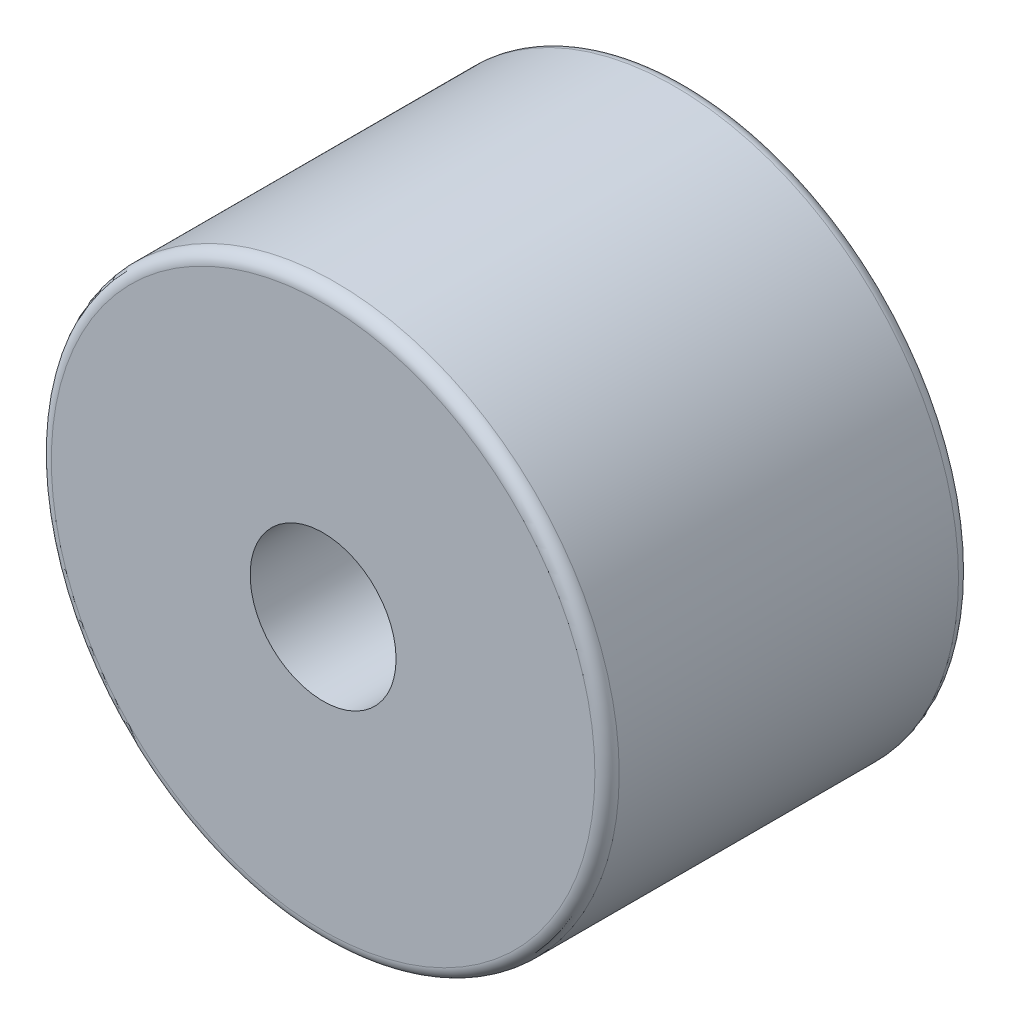
ISO-10303-21;
HEADER;
FILE_DESCRIPTION(('STEP AP214'),'2;1');
FILE_NAME('part.step','',(''),(''),'','','');
FILE_SCHEMA(('AUTOMOTIVE_DESIGN { 1 0 10303 214 1 1 1 1 }'));
ENDSEC;
DATA;
#1=APPLICATION_CONTEXT('core data for automotive mechanical design processes');
#2=APPLICATION_PROTOCOL_DEFINITION('international standard','automotive_design',2000,#1);
#3=PRODUCT_CONTEXT('',#1,'mechanical');
#4=PRODUCT('Part','Part','',(#3));
#5=PRODUCT_RELATED_PRODUCT_CATEGORY('part','',(#4));
#6=PRODUCT_DEFINITION_FORMATION('','',#4);
#7=PRODUCT_DEFINITION_CONTEXT('part definition',#1,'design');
#8=PRODUCT_DEFINITION('design','',#6,#7);
#9=PRODUCT_DEFINITION_SHAPE('','',#8);
#10=(LENGTH_UNIT() NAMED_UNIT(*) SI_UNIT(.MILLI.,.METRE.));
#11=(NAMED_UNIT(*) PLANE_ANGLE_UNIT() SI_UNIT($,.RADIAN.));
#12=(NAMED_UNIT(*) SI_UNIT($,.STERADIAN.) SOLID_ANGLE_UNIT());
#13=UNCERTAINTY_MEASURE_WITH_UNIT(LENGTH_MEASURE(1.E-05),#10,'distance_accuracy_value','');
#14=(GEOMETRIC_REPRESENTATION_CONTEXT(3) GLOBAL_UNCERTAINTY_ASSIGNED_CONTEXT((#13)) GLOBAL_UNIT_ASSIGNED_CONTEXT((#10,
#11,#12)) REPRESENTATION_CONTEXT('',''));
#15=CARTESIAN_POINT('',(0.,0.,0.));
#16=DIRECTION('',(0.,0.,1.));
#17=DIRECTION('',(1.,0.,0.));
#18=AXIS2_PLACEMENT_3D('',#15,#16,#17);
#19=CARTESIAN_POINT('',(0.,0.,0.));
#20=DIRECTION('',(0.,0.,1.));
#21=DIRECTION('',(1.,0.,0.));
#22=AXIS2_PLACEMENT_3D('',#19,#20,#21);
#23=PLANE('',#22);
#24=CARTESIAN_POINT('',(0.,0.,0.));
#25=DIRECTION('',(0.,0.,1.));
#26=DIRECTION('',(1.,0.,0.));
#27=AXIS2_PLACEMENT_3D('',#24,#25,#26);
#28=CIRCLE('',#27,0.6);
#29=CARTESIAN_POINT('',(0.6,0.,0.));
#30=VERTEX_POINT('',#29);
#31=EDGE_CURVE('E10',#30,#30,#28,.T.);
#32=ORIENTED_EDGE('',*,*,#31,.T.);
#33=EDGE_LOOP('',(#32));
#34=FACE_BOUND('',#33,.T.);
#35=CARTESIAN_POINT('',(0.,0.,0.));
#36=DIRECTION('',(0.,0.,-1.));
#37=DIRECTION('',(1.,0.,0.));
#38=AXIS2_PLACEMENT_3D('',#35,#36,#37);
#39=CIRCLE('',#38,2.235);
#40=CARTESIAN_POINT('',(2.235,0.,0.));
#41=VERTEX_POINT('',#40);
#42=EDGE_CURVE('E33',#41,#41,#39,.T.);
#43=ORIENTED_EDGE('',*,*,#42,.T.);
#44=EDGE_LOOP('',(#43));
#45=FACE_BOUND('',#44,.T.);
#46=ADVANCED_FACE('F15',(#34,#45),#23,.F.);
#47=CARTESIAN_POINT('',(0.,0.,2.99));
#48=DIRECTION('',(0.,0.,1.));
#49=DIRECTION('',(1.,0.,0.));
#50=AXIS2_PLACEMENT_3D('',#47,#48,#49);
#51=PLANE('',#50);
#52=CARTESIAN_POINT('',(0.,0.,2.99));
#53=DIRECTION('',(0.,0.,1.));
#54=DIRECTION('',(1.,0.,0.));
#55=AXIS2_PLACEMENT_3D('',#52,#53,#54);
#56=CIRCLE('',#55,0.6);
#57=CARTESIAN_POINT('',(0.6,0.,2.99));
#58=VERTEX_POINT('',#57);
#59=EDGE_CURVE('E22',#58,#58,#56,.T.);
#60=ORIENTED_EDGE('',*,*,#59,.F.);
#61=EDGE_LOOP('',(#60));
#62=FACE_BOUND('',#61,.T.);
#63=CARTESIAN_POINT('',(0.,0.,2.99));
#64=DIRECTION('',(0.,0.,1.));
#65=DIRECTION('',(1.,0.,0.));
#66=AXIS2_PLACEMENT_3D('',#63,#64,#65);
#67=CIRCLE('',#66,2.235);
#68=CARTESIAN_POINT('',(2.235,0.,2.99));
#69=VERTEX_POINT('',#68);
#70=EDGE_CURVE('E55',#69,#69,#67,.T.);
#71=ORIENTED_EDGE('',*,*,#70,.T.);
#72=EDGE_LOOP('',(#71));
#73=FACE_BOUND('',#72,.T.);
#74=ADVANCED_FACE('F61',(#62,#73),#51,.T.);
#75=CARTESIAN_POINT('',(0.,0.,2.99));
#76=DIRECTION('',(0.,0.,-1.));
#77=DIRECTION('',(-1.,0.,0.));
#78=AXIS2_PLACEMENT_3D('',#75,#76,#77);
#79=CYLINDRICAL_SURFACE('',#78,2.335);
#80=CARTESIAN_POINT('',(0.,0.,2.89));
#81=DIRECTION('',(0.,0.,-1.));
#82=DIRECTION('',(1.,0.,0.));
#83=AXIS2_PLACEMENT_3D('',#80,#81,#82);
#84=CIRCLE('',#83,2.335);
#85=CARTESIAN_POINT('',(2.335,0.,2.89));
#86=VERTEX_POINT('',#85);
#87=EDGE_CURVE('E45',#86,#86,#84,.T.);
#88=ORIENTED_EDGE('',*,*,#87,.T.);
#89=EDGE_LOOP('',(#88));
#90=FACE_BOUND('',#89,.T.);
#91=CARTESIAN_POINT('',(0.,0.,0.1));
#92=DIRECTION('',(0.,0.,1.));
#93=DIRECTION('',(1.,0.,0.));
#94=AXIS2_PLACEMENT_3D('',#91,#92,#93);
#95=CIRCLE('',#94,2.335);
#96=CARTESIAN_POINT('',(2.335,0.,0.1));
#97=VERTEX_POINT('',#96);
#98=EDGE_CURVE('E39',#97,#97,#95,.T.);
#99=ORIENTED_EDGE('',*,*,#98,.T.);
#100=EDGE_LOOP('',(#99));
#101=FACE_BOUND('',#100,.T.);
#102=ADVANCED_FACE('F78',(#90,#101),#79,.T.);
#103=CARTESIAN_POINT('',(0.,0.,2.99));
#104=DIRECTION('',(0.,0.,-1.));
#105=DIRECTION('',(-1.,0.,0.));
#106=AXIS2_PLACEMENT_3D('',#103,#104,#105);
#107=CYLINDRICAL_SURFACE('',#106,0.6);
#108=ORIENTED_EDGE('',*,*,#31,.F.);
#109=EDGE_LOOP('',(#108));
#110=FACE_BOUND('',#109,.T.);
#111=ORIENTED_EDGE('',*,*,#59,.T.);
#112=EDGE_LOOP('',(#111));
#113=FACE_BOUND('',#112,.T.);
#114=ADVANCED_FACE('F71',(#110,#113),#107,.F.);
#115=CARTESIAN_POINT('',(0.,0.,0.1));
#116=DIRECTION('',(0.,0.,1.));
#117=DIRECTION('',(1.,0.,0.));
#118=AXIS2_PLACEMENT_3D('',#115,#116,#117);
#119=TOROIDAL_SURFACE('',#118,2.235,0.1);
#120=ORIENTED_EDGE('',*,*,#42,.F.);
#121=EDGE_LOOP('',(#120));
#122=FACE_BOUND('',#121,.T.);
#123=ORIENTED_EDGE('',*,*,#98,.F.);
#124=EDGE_LOOP('',(#123));
#125=FACE_BOUND('',#124,.T.);
#126=ADVANCED_FACE('F65',(#122,#125),#119,.T.);
#127=CARTESIAN_POINT('',(0.,0.,2.89));
#128=DIRECTION('',(0.,0.,1.));
#129=DIRECTION('',(1.,0.,0.));
#130=AXIS2_PLACEMENT_3D('',#127,#128,#129);
#131=TOROIDAL_SURFACE('',#130,2.235,0.1);
#132=ORIENTED_EDGE('',*,*,#87,.F.);
#133=EDGE_LOOP('',(#132));
#134=FACE_BOUND('',#133,.T.);
#135=ORIENTED_EDGE('',*,*,#70,.F.);
#136=EDGE_LOOP('',(#135));
#137=FACE_BOUND('',#136,.T.);
#138=ADVANCED_FACE('F64',(#134,#137),#131,.T.);
#139=CLOSED_SHELL('',(#46,#74,#102,#114,#126,#138));
#140=MANIFOLD_SOLID_BREP('B1',#139);
#141=ADVANCED_BREP_SHAPE_REPRESENTATION('',(#18,#140),#14);
#142=SHAPE_DEFINITION_REPRESENTATION(#9,#141);
ENDSEC;
END-ISO-10303-21;
